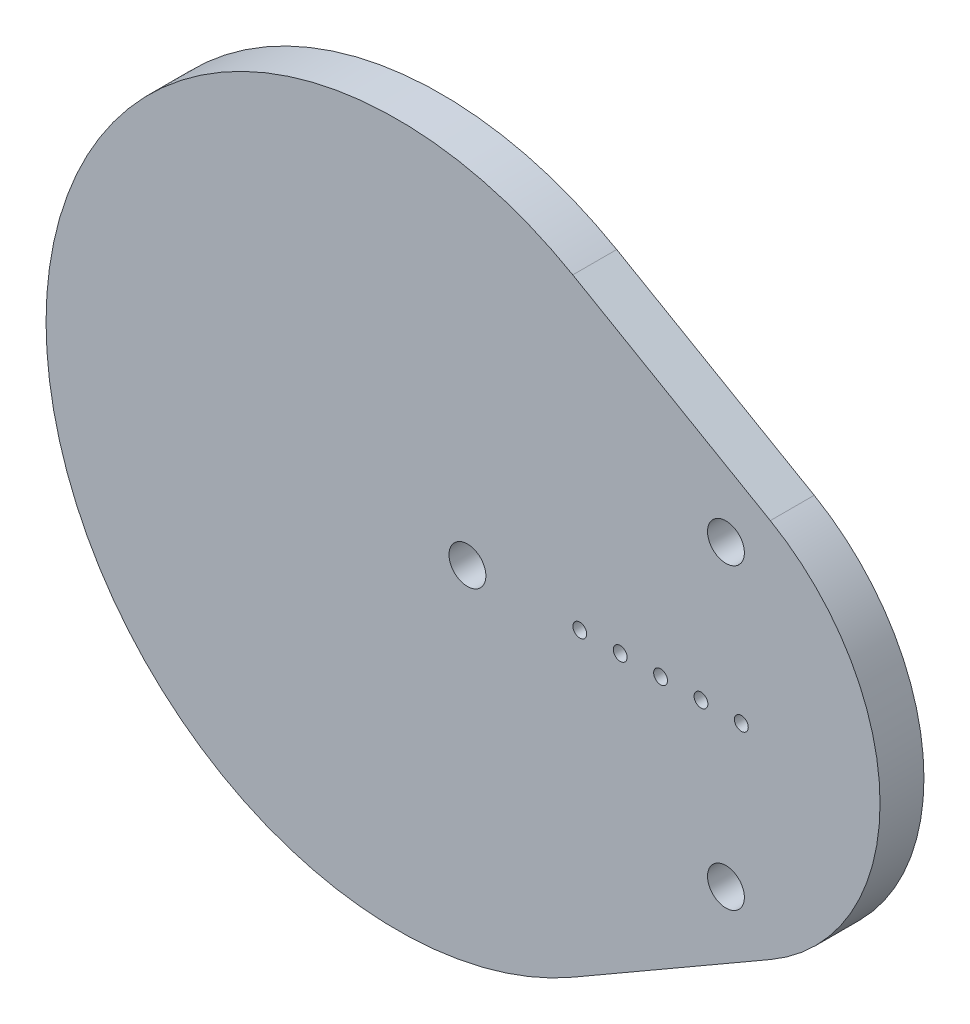
ISO-10303-21;
HEADER;
FILE_DESCRIPTION(('STEP AP214'),'2;1');
FILE_NAME('part.step','',(''),(''),'','','');
FILE_SCHEMA(('AUTOMOTIVE_DESIGN { 1 0 10303 214 1 1 1 1 }'));
ENDSEC;
DATA;
#1=APPLICATION_CONTEXT('core data for automotive mechanical design processes');
#2=APPLICATION_PROTOCOL_DEFINITION('international standard','automotive_design',2000,#1);
#3=PRODUCT_CONTEXT('',#1,'mechanical');
#4=PRODUCT('Part','Part','',(#3));
#5=PRODUCT_RELATED_PRODUCT_CATEGORY('part','',(#4));
#6=PRODUCT_DEFINITION_FORMATION('','',#4);
#7=PRODUCT_DEFINITION_CONTEXT('part definition',#1,'design');
#8=PRODUCT_DEFINITION('design','',#6,#7);
#9=PRODUCT_DEFINITION_SHAPE('','',#8);
#10=(LENGTH_UNIT() NAMED_UNIT(*) SI_UNIT(.MILLI.,.METRE.));
#11=(NAMED_UNIT(*) PLANE_ANGLE_UNIT() SI_UNIT($,.RADIAN.));
#12=(NAMED_UNIT(*) SI_UNIT($,.STERADIAN.) SOLID_ANGLE_UNIT());
#13=UNCERTAINTY_MEASURE_WITH_UNIT(LENGTH_MEASURE(1.E-05),#10,'distance_accuracy_value','');
#14=(GEOMETRIC_REPRESENTATION_CONTEXT(3) GLOBAL_UNCERTAINTY_ASSIGNED_CONTEXT((#13)) GLOBAL_UNIT_ASSIGNED_CONTEXT((#10,
#11,#12)) REPRESENTATION_CONTEXT('',''));
#15=CARTESIAN_POINT('',(0.,0.,0.));
#16=DIRECTION('',(0.,0.,1.));
#17=DIRECTION('',(1.,0.,0.));
#18=AXIS2_PLACEMENT_3D('',#15,#16,#17);
#19=CARTESIAN_POINT('',(-38.1,0.,6.35));
#20=DIRECTION('',(0.,0.,-1.));
#21=DIRECTION('',(-1.,0.,0.));
#22=AXIS2_PLACEMENT_3D('',#19,#20,#21);
#23=CYLINDRICAL_SURFACE('',#22,50.8);
#24=CARTESIAN_POINT('',(-38.1,0.,0.));
#25=DIRECTION('',(0.,0.,1.));
#26=DIRECTION('',(1.,0.,0.));
#27=AXIS2_PLACEMENT_3D('',#24,#25,#26);
#28=CIRCLE('',#27,50.8);
#29=CARTESIAN_POINT('',(-12.7,43.9940905122495,0.));
#30=VERTEX_POINT('',#29);
#31=CARTESIAN_POINT('',(-12.7,-43.9940905122495,0.));
#32=VERTEX_POINT('',#31);
#33=EDGE_CURVE('E273',#30,#32,#28,.T.);
#34=ORIENTED_EDGE('',*,*,#33,.T.);
#35=DIRECTION('',(0.,0.,-1.));
#36=VECTOR('',#35,1.);
#37=CARTESIAN_POINT('',(-12.7,-43.9940905122495,6.35));
#38=LINE('',#37,#36);
#39=CARTESIAN_POINT('',(-12.7,-43.9940905122495,6.35));
#40=VERTEX_POINT('',#39);
#41=EDGE_CURVE('E227',#40,#32,#38,.T.);
#42=ORIENTED_EDGE('',*,*,#41,.F.);
#43=CARTESIAN_POINT('',(-38.1,0.,6.35));
#44=DIRECTION('',(0.,0.,1.));
#45=DIRECTION('',(1.,0.,0.));
#46=AXIS2_PLACEMENT_3D('',#43,#44,#45);
#47=CIRCLE('',#46,50.8);
#48=CARTESIAN_POINT('',(-12.7,43.9940905122495,6.35));
#49=VERTEX_POINT('',#48);
#50=EDGE_CURVE('E261',#49,#40,#47,.T.);
#51=ORIENTED_EDGE('',*,*,#50,.F.);
#52=DIRECTION('',(0.,0.,-1.));
#53=VECTOR('',#52,1.);
#54=CARTESIAN_POINT('',(-12.7,43.9940905122495,6.35));
#55=LINE('',#54,#53);
#56=EDGE_CURVE('E12',#49,#30,#55,.T.);
#57=ORIENTED_EDGE('',*,*,#56,.T.);
#58=EDGE_LOOP('',(#34,#42,#51,#57));
#59=FACE_BOUND('',#58,.T.);
#60=ADVANCED_FACE('F217',(#59),#23,.T.);
#61=CARTESIAN_POINT('',(15.875,-27.4963065701559,6.35));
#62=DIRECTION('',(0.5,-0.866025403784439,0.));
#63=DIRECTION('',(0.866025403784439,0.5,0.));
#64=AXIS2_PLACEMENT_3D('',#61,#62,#63);
#65=PLANE('',#64);
#66=DIRECTION('',(-0.866025403784439,-0.5,0.));
#67=VECTOR('',#66,1.);
#68=CARTESIAN_POINT('',(15.875,-27.4963065701559,0.));
#69=LINE('',#68,#67);
#70=CARTESIAN_POINT('',(15.875,-27.4963065701559,0.));
#71=VERTEX_POINT('',#70);
#72=EDGE_CURVE('E287',#71,#32,#69,.T.);
#73=ORIENTED_EDGE('',*,*,#72,.F.);
#74=DIRECTION('',(0.,0.,-1.));
#75=VECTOR('',#74,1.);
#76=CARTESIAN_POINT('',(15.875,-27.4963065701559,6.35));
#77=LINE('',#76,#75);
#78=CARTESIAN_POINT('',(15.875,-27.4963065701559,6.35));
#79=VERTEX_POINT('',#78);
#80=EDGE_CURVE('E250',#79,#71,#77,.T.);
#81=ORIENTED_EDGE('',*,*,#80,.F.);
#82=DIRECTION('',(-0.866025403784439,-0.5,0.));
#83=VECTOR('',#82,1.);
#84=CARTESIAN_POINT('',(15.875,-27.4963065701559,6.35));
#85=LINE('',#84,#83);
#86=EDGE_CURVE('E268',#79,#40,#85,.T.);
#87=ORIENTED_EDGE('',*,*,#86,.T.);
#88=ORIENTED_EDGE('',*,*,#41,.T.);
#89=EDGE_LOOP('',(#73,#81,#87,#88));
#90=FACE_BOUND('',#89,.T.);
#91=ADVANCED_FACE('F278',(#90),#65,.T.);
#92=CARTESIAN_POINT('',(15.875,27.4963065701559,6.35));
#93=DIRECTION('',(-0.5,-0.866025403784439,0.));
#94=DIRECTION('',(0.866025403784439,-0.5,0.));
#95=AXIS2_PLACEMENT_3D('',#92,#93,#94);
#96=PLANE('',#95);
#97=DIRECTION('',(-0.866025403784439,0.5,0.));
#98=VECTOR('',#97,1.);
#99=CARTESIAN_POINT('',(15.875,27.4963065701559,0.));
#100=LINE('',#99,#98);
#101=CARTESIAN_POINT('',(15.875,27.4963065701559,0.));
#102=VERTEX_POINT('',#101);
#103=EDGE_CURVE('E283',#102,#30,#100,.T.);
#104=ORIENTED_EDGE('',*,*,#103,.T.);
#105=ORIENTED_EDGE('',*,*,#56,.F.);
#106=DIRECTION('',(-0.866025403784439,0.5,0.));
#107=VECTOR('',#106,1.);
#108=CARTESIAN_POINT('',(15.875,27.4963065701559,6.35));
#109=LINE('',#108,#107);
#110=CARTESIAN_POINT('',(15.875,27.4963065701559,6.35));
#111=VERTEX_POINT('',#110);
#112=EDGE_CURVE('E269',#111,#49,#109,.T.);
#113=ORIENTED_EDGE('',*,*,#112,.F.);
#114=DIRECTION('',(0.,0.,-1.));
#115=VECTOR('',#114,1.);
#116=CARTESIAN_POINT('',(15.875,27.4963065701559,6.35));
#117=LINE('',#116,#115);
#118=EDGE_CURVE('E236',#111,#102,#117,.T.);
#119=ORIENTED_EDGE('',*,*,#118,.T.);
#120=EDGE_LOOP('',(#104,#105,#113,#119));
#121=FACE_BOUND('',#120,.T.);
#122=ADVANCED_FACE('F341',(#121),#96,.F.);
#123=CARTESIAN_POINT('',(0.,0.,0.));
#124=DIRECTION('',(0.,0.,1.));
#125=DIRECTION('',(1.,0.,0.));
#126=AXIS2_PLACEMENT_3D('',#123,#124,#125);
#127=PLANE('',#126);
#128=ORIENTED_EDGE('',*,*,#103,.F.);
#129=CARTESIAN_POINT('',(0.,0.,0.));
#130=DIRECTION('',(0.,0.,1.));
#131=DIRECTION('',(1.,0.,0.));
#132=AXIS2_PLACEMENT_3D('',#129,#130,#131);
#133=CIRCLE('',#132,31.75);
#134=EDGE_CURVE('E221',#71,#102,#133,.T.);
#135=ORIENTED_EDGE('',*,*,#134,.F.);
#136=ORIENTED_EDGE('',*,*,#72,.T.);
#137=ORIENTED_EDGE('',*,*,#33,.F.);
#138=EDGE_LOOP('',(#128,#135,#136,#137));
#139=FACE_BOUND('',#138,.T.);
#140=CARTESIAN_POINT('',(9.45497693541205,21.59,0.));
#141=DIRECTION('',(0.,0.,1.));
#142=DIRECTION('',(1.,0.,0.));
#143=AXIS2_PLACEMENT_3D('',#140,#141,#142);
#144=CIRCLE('',#143,2.66500000000001);
#145=CARTESIAN_POINT('',(12.1199769354121,21.59,0.));
#146=VERTEX_POINT('',#145);
#147=EDGE_CURVE('E330',#146,#146,#144,.T.);
#148=ORIENTED_EDGE('',*,*,#147,.T.);
#149=EDGE_LOOP('',(#148));
#150=FACE_BOUND('',#149,.T.);
#151=CARTESIAN_POINT('',(9.45497693541207,-21.59,0.));
#152=DIRECTION('',(0.,0.,1.));
#153=DIRECTION('',(1.,0.,0.));
#154=AXIS2_PLACEMENT_3D('',#151,#152,#153);
#155=CIRCLE('',#154,2.66500000000001);
#156=CARTESIAN_POINT('',(12.1199769354121,-21.59,0.));
#157=VERTEX_POINT('',#156);
#158=EDGE_CURVE('E324',#157,#157,#155,.T.);
#159=ORIENTED_EDGE('',*,*,#158,.T.);
#160=EDGE_LOOP('',(#159));
#161=FACE_BOUND('',#160,.T.);
#162=CARTESIAN_POINT('',(-27.94,0.,0.));
#163=DIRECTION('',(0.,0.,1.));
#164=DIRECTION('',(1.,0.,0.));
#165=AXIS2_PLACEMENT_3D('',#162,#163,#164);
#166=CIRCLE('',#165,2.665);
#167=CARTESIAN_POINT('',(-25.275,0.,0.));
#168=VERTEX_POINT('',#167);
#169=EDGE_CURVE('E318',#168,#168,#166,.T.);
#170=ORIENTED_EDGE('',*,*,#169,.T.);
#171=EDGE_LOOP('',(#170));
#172=FACE_BOUND('',#171,.T.);
#173=CARTESIAN_POINT('',(-11.684,0.,0.));
#174=DIRECTION('',(0.,0.,1.));
#175=DIRECTION('',(1.,0.,0.));
#176=AXIS2_PLACEMENT_3D('',#173,#174,#175);
#177=CIRCLE('',#176,1.);
#178=CARTESIAN_POINT('',(-10.684,0.,0.));
#179=VERTEX_POINT('',#178);
#180=EDGE_CURVE('E312',#179,#179,#177,.T.);
#181=ORIENTED_EDGE('',*,*,#180,.T.);
#182=EDGE_LOOP('',(#181));
#183=FACE_BOUND('',#182,.T.);
#184=CARTESIAN_POINT('',(0.,0.,0.));
#185=DIRECTION('',(0.,0.,1.));
#186=DIRECTION('',(1.,0.,0.));
#187=AXIS2_PLACEMENT_3D('',#184,#185,#186);
#188=CIRCLE('',#187,1.);
#189=CARTESIAN_POINT('',(1.,0.,0.));
#190=VERTEX_POINT('',#189);
#191=EDGE_CURVE('E306',#190,#190,#188,.T.);
#192=ORIENTED_EDGE('',*,*,#191,.T.);
#193=EDGE_LOOP('',(#192));
#194=FACE_BOUND('',#193,.T.);
#195=CARTESIAN_POINT('',(5.842,0.,0.));
#196=DIRECTION('',(0.,0.,1.));
#197=DIRECTION('',(1.,0.,0.));
#198=AXIS2_PLACEMENT_3D('',#195,#196,#197);
#199=CIRCLE('',#198,1.);
#200=CARTESIAN_POINT('',(6.842,0.,0.));
#201=VERTEX_POINT('',#200);
#202=EDGE_CURVE('E300',#201,#201,#199,.T.);
#203=ORIENTED_EDGE('',*,*,#202,.T.);
#204=EDGE_LOOP('',(#203));
#205=FACE_BOUND('',#204,.T.);
#206=CARTESIAN_POINT('',(11.684,0.,0.));
#207=DIRECTION('',(0.,0.,1.));
#208=DIRECTION('',(1.,0.,0.));
#209=AXIS2_PLACEMENT_3D('',#206,#207,#208);
#210=CIRCLE('',#209,1.);
#211=CARTESIAN_POINT('',(12.684,0.,0.));
#212=VERTEX_POINT('',#211);
#213=EDGE_CURVE('E293',#212,#212,#210,.T.);
#214=ORIENTED_EDGE('',*,*,#213,.T.);
#215=EDGE_LOOP('',(#214));
#216=FACE_BOUND('',#215,.T.);
#217=CARTESIAN_POINT('',(-5.842,0.,0.));
#218=DIRECTION('',(0.,0.,1.));
#219=DIRECTION('',(1.,0.,0.));
#220=AXIS2_PLACEMENT_3D('',#217,#218,#219);
#221=CIRCLE('',#220,1.);
#222=CARTESIAN_POINT('',(-4.842,0.,0.));
#223=VERTEX_POINT('',#222);
#224=EDGE_CURVE('E294',#223,#223,#221,.T.);
#225=ORIENTED_EDGE('',*,*,#224,.T.);
#226=EDGE_LOOP('',(#225));
#227=FACE_BOUND('',#226,.T.);
#228=ADVANCED_FACE('F339',(#139,#150,#161,#172,#183,#194,#205,#216,#227),#127,.F.);
#229=CARTESIAN_POINT('',(0.,0.,6.35));
#230=DIRECTION('',(0.,0.,1.));
#231=DIRECTION('',(1.,0.,0.));
#232=AXIS2_PLACEMENT_3D('',#229,#230,#231);
#233=PLANE('',#232);
#234=ORIENTED_EDGE('',*,*,#112,.T.);
#235=ORIENTED_EDGE('',*,*,#50,.T.);
#236=ORIENTED_EDGE('',*,*,#86,.F.);
#237=CARTESIAN_POINT('',(0.,0.,6.35));
#238=DIRECTION('',(0.,0.,1.));
#239=DIRECTION('',(1.,0.,0.));
#240=AXIS2_PLACEMENT_3D('',#237,#238,#239);
#241=CIRCLE('',#240,31.75);
#242=EDGE_CURVE('E285',#79,#111,#241,.T.);
#243=ORIENTED_EDGE('',*,*,#242,.T.);
#244=EDGE_LOOP('',(#234,#235,#236,#243));
#245=FACE_BOUND('',#244,.T.);
#246=CARTESIAN_POINT('',(11.684,0.,6.35));
#247=DIRECTION('',(0.,0.,1.));
#248=DIRECTION('',(1.,0.,0.));
#249=AXIS2_PLACEMENT_3D('',#246,#247,#248);
#250=CIRCLE('',#249,1.);
#251=CARTESIAN_POINT('',(12.684,0.,6.35));
#252=VERTEX_POINT('',#251);
#253=EDGE_CURVE('E297',#252,#252,#250,.T.);
#254=ORIENTED_EDGE('',*,*,#253,.F.);
#255=EDGE_LOOP('',(#254));
#256=FACE_BOUND('',#255,.T.);
#257=CARTESIAN_POINT('',(0.,0.,6.35));
#258=DIRECTION('',(0.,0.,1.));
#259=DIRECTION('',(1.,0.,0.));
#260=AXIS2_PLACEMENT_3D('',#257,#258,#259);
#261=CIRCLE('',#260,1.);
#262=CARTESIAN_POINT('',(1.,0.,6.35));
#263=VERTEX_POINT('',#262);
#264=EDGE_CURVE('E309',#263,#263,#261,.T.);
#265=ORIENTED_EDGE('',*,*,#264,.F.);
#266=EDGE_LOOP('',(#265));
#267=FACE_BOUND('',#266,.T.);
#268=CARTESIAN_POINT('',(-27.94,0.,6.35));
#269=DIRECTION('',(0.,0.,1.));
#270=DIRECTION('',(1.,0.,0.));
#271=AXIS2_PLACEMENT_3D('',#268,#269,#270);
#272=CIRCLE('',#271,2.665);
#273=CARTESIAN_POINT('',(-25.275,0.,6.35));
#274=VERTEX_POINT('',#273);
#275=EDGE_CURVE('E321',#274,#274,#272,.T.);
#276=ORIENTED_EDGE('',*,*,#275,.F.);
#277=EDGE_LOOP('',(#276));
#278=FACE_BOUND('',#277,.T.);
#279=CARTESIAN_POINT('',(9.45497693541205,21.59,6.35));
#280=DIRECTION('',(0.,0.,1.));
#281=DIRECTION('',(1.,0.,0.));
#282=AXIS2_PLACEMENT_3D('',#279,#280,#281);
#283=CIRCLE('',#282,2.66500000000001);
#284=CARTESIAN_POINT('',(12.1199769354121,21.59,6.35));
#285=VERTEX_POINT('',#284);
#286=EDGE_CURVE('E333',#285,#285,#283,.T.);
#287=ORIENTED_EDGE('',*,*,#286,.F.);
#288=EDGE_LOOP('',(#287));
#289=FACE_BOUND('',#288,.T.);
#290=CARTESIAN_POINT('',(9.45497693541207,-21.59,6.35));
#291=DIRECTION('',(0.,0.,1.));
#292=DIRECTION('',(1.,0.,0.));
#293=AXIS2_PLACEMENT_3D('',#290,#291,#292);
#294=CIRCLE('',#293,2.66500000000001);
#295=CARTESIAN_POINT('',(12.1199769354121,-21.59,6.35));
#296=VERTEX_POINT('',#295);
#297=EDGE_CURVE('E327',#296,#296,#294,.T.);
#298=ORIENTED_EDGE('',*,*,#297,.F.);
#299=EDGE_LOOP('',(#298));
#300=FACE_BOUND('',#299,.T.);
#301=CARTESIAN_POINT('',(-11.684,0.,6.35));
#302=DIRECTION('',(0.,0.,1.));
#303=DIRECTION('',(1.,0.,0.));
#304=AXIS2_PLACEMENT_3D('',#301,#302,#303);
#305=CIRCLE('',#304,1.);
#306=CARTESIAN_POINT('',(-10.684,0.,6.35));
#307=VERTEX_POINT('',#306);
#308=EDGE_CURVE('E315',#307,#307,#305,.T.);
#309=ORIENTED_EDGE('',*,*,#308,.F.);
#310=EDGE_LOOP('',(#309));
#311=FACE_BOUND('',#310,.T.);
#312=CARTESIAN_POINT('',(5.842,0.,6.35));
#313=DIRECTION('',(0.,0.,1.));
#314=DIRECTION('',(1.,0.,0.));
#315=AXIS2_PLACEMENT_3D('',#312,#313,#314);
#316=CIRCLE('',#315,1.);
#317=CARTESIAN_POINT('',(6.842,0.,6.35));
#318=VERTEX_POINT('',#317);
#319=EDGE_CURVE('E303',#318,#318,#316,.T.);
#320=ORIENTED_EDGE('',*,*,#319,.F.);
#321=EDGE_LOOP('',(#320));
#322=FACE_BOUND('',#321,.T.);
#323=CARTESIAN_POINT('',(-5.842,0.,6.35));
#324=DIRECTION('',(0.,0.,1.));
#325=DIRECTION('',(1.,0.,0.));
#326=AXIS2_PLACEMENT_3D('',#323,#324,#325);
#327=CIRCLE('',#326,1.);
#328=CARTESIAN_POINT('',(-4.842,0.,6.35));
#329=VERTEX_POINT('',#328);
#330=EDGE_CURVE('E290',#329,#329,#327,.T.);
#331=ORIENTED_EDGE('',*,*,#330,.F.);
#332=EDGE_LOOP('',(#331));
#333=FACE_BOUND('',#332,.T.);
#334=ADVANCED_FACE('F265',(#245,#256,#267,#278,#289,#300,#311,#322,#333),#233,.T.);
#335=CARTESIAN_POINT('',(-5.842,0.,6.35));
#336=DIRECTION('',(0.,0.,-1.));
#337=DIRECTION('',(-1.,0.,0.));
#338=AXIS2_PLACEMENT_3D('',#335,#336,#337);
#339=CYLINDRICAL_SURFACE('',#338,1.);
#340=ORIENTED_EDGE('',*,*,#330,.T.);
#341=EDGE_LOOP('',(#340));
#342=FACE_BOUND('',#341,.T.);
#343=ORIENTED_EDGE('',*,*,#224,.F.);
#344=EDGE_LOOP('',(#343));
#345=FACE_BOUND('',#344,.T.);
#346=ADVANCED_FACE('F357',(#342,#345),#339,.F.);
#347=CARTESIAN_POINT('',(11.684,0.,6.35));
#348=DIRECTION('',(0.,0.,-1.));
#349=DIRECTION('',(-1.,0.,0.));
#350=AXIS2_PLACEMENT_3D('',#347,#348,#349);
#351=CYLINDRICAL_SURFACE('',#350,1.);
#352=ORIENTED_EDGE('',*,*,#253,.T.);
#353=EDGE_LOOP('',(#352));
#354=FACE_BOUND('',#353,.T.);
#355=ORIENTED_EDGE('',*,*,#213,.F.);
#356=EDGE_LOOP('',(#355));
#357=FACE_BOUND('',#356,.T.);
#358=ADVANCED_FACE('F361',(#354,#357),#351,.F.);
#359=CARTESIAN_POINT('',(5.842,0.,6.35));
#360=DIRECTION('',(0.,0.,-1.));
#361=DIRECTION('',(-1.,0.,0.));
#362=AXIS2_PLACEMENT_3D('',#359,#360,#361);
#363=CYLINDRICAL_SURFACE('',#362,1.);
#364=ORIENTED_EDGE('',*,*,#319,.T.);
#365=EDGE_LOOP('',(#364));
#366=FACE_BOUND('',#365,.T.);
#367=ORIENTED_EDGE('',*,*,#202,.F.);
#368=EDGE_LOOP('',(#367));
#369=FACE_BOUND('',#368,.T.);
#370=ADVANCED_FACE('F388',(#366,#369),#363,.F.);
#371=CARTESIAN_POINT('',(0.,0.,6.35));
#372=DIRECTION('',(0.,0.,-1.));
#373=DIRECTION('',(-1.,0.,0.));
#374=AXIS2_PLACEMENT_3D('',#371,#372,#373);
#375=CYLINDRICAL_SURFACE('',#374,1.);
#376=ORIENTED_EDGE('',*,*,#264,.T.);
#377=EDGE_LOOP('',(#376));
#378=FACE_BOUND('',#377,.T.);
#379=ORIENTED_EDGE('',*,*,#191,.F.);
#380=EDGE_LOOP('',(#379));
#381=FACE_BOUND('',#380,.T.);
#382=ADVANCED_FACE('F384',(#378,#381),#375,.F.);
#383=CARTESIAN_POINT('',(-11.684,0.,6.35));
#384=DIRECTION('',(0.,0.,-1.));
#385=DIRECTION('',(-1.,0.,0.));
#386=AXIS2_PLACEMENT_3D('',#383,#384,#385);
#387=CYLINDRICAL_SURFACE('',#386,1.);
#388=ORIENTED_EDGE('',*,*,#308,.T.);
#389=EDGE_LOOP('',(#388));
#390=FACE_BOUND('',#389,.T.);
#391=ORIENTED_EDGE('',*,*,#180,.F.);
#392=EDGE_LOOP('',(#391));
#393=FACE_BOUND('',#392,.T.);
#394=ADVANCED_FACE('F380',(#390,#393),#387,.F.);
#395=CARTESIAN_POINT('',(-27.94,0.,6.35));
#396=DIRECTION('',(0.,0.,-1.));
#397=DIRECTION('',(-1.,0.,0.));
#398=AXIS2_PLACEMENT_3D('',#395,#396,#397);
#399=CYLINDRICAL_SURFACE('',#398,2.665);
#400=ORIENTED_EDGE('',*,*,#275,.T.);
#401=EDGE_LOOP('',(#400));
#402=FACE_BOUND('',#401,.T.);
#403=ORIENTED_EDGE('',*,*,#169,.F.);
#404=EDGE_LOOP('',(#403));
#405=FACE_BOUND('',#404,.T.);
#406=ADVANCED_FACE('F373',(#402,#405),#399,.F.);
#407=CARTESIAN_POINT('',(9.45497693541207,-21.59,6.35));
#408=DIRECTION('',(0.,0.,-1.));
#409=DIRECTION('',(-1.,0.,0.));
#410=AXIS2_PLACEMENT_3D('',#407,#408,#409);
#411=CYLINDRICAL_SURFACE('',#410,2.66500000000001);
#412=ORIENTED_EDGE('',*,*,#297,.T.);
#413=EDGE_LOOP('',(#412));
#414=FACE_BOUND('',#413,.T.);
#415=ORIENTED_EDGE('',*,*,#158,.F.);
#416=EDGE_LOOP('',(#415));
#417=FACE_BOUND('',#416,.T.);
#418=ADVANCED_FACE('F368',(#414,#417),#411,.F.);
#419=CARTESIAN_POINT('',(9.45497693541205,21.59,6.35));
#420=DIRECTION('',(0.,0.,-1.));
#421=DIRECTION('',(-1.,0.,0.));
#422=AXIS2_PLACEMENT_3D('',#419,#420,#421);
#423=CYLINDRICAL_SURFACE('',#422,2.66500000000001);
#424=ORIENTED_EDGE('',*,*,#286,.T.);
#425=EDGE_LOOP('',(#424));
#426=FACE_BOUND('',#425,.T.);
#427=ORIENTED_EDGE('',*,*,#147,.F.);
#428=EDGE_LOOP('',(#427));
#429=FACE_BOUND('',#428,.T.);
#430=ADVANCED_FACE('F364',(#426,#429),#423,.F.);
#431=CARTESIAN_POINT('',(0.,0.,6.35));
#432=DIRECTION('',(0.,0.,-1.));
#433=DIRECTION('',(-1.,0.,0.));
#434=AXIS2_PLACEMENT_3D('',#431,#432,#433);
#435=CYLINDRICAL_SURFACE('',#434,31.75);
#436=ORIENTED_EDGE('',*,*,#134,.T.);
#437=ORIENTED_EDGE('',*,*,#118,.F.);
#438=ORIENTED_EDGE('',*,*,#242,.F.);
#439=ORIENTED_EDGE('',*,*,#80,.T.);
#440=EDGE_LOOP('',(#436,#437,#438,#439));
#441=FACE_BOUND('',#440,.T.);
#442=ADVANCED_FACE('F219',(#441),#435,.T.);
#443=CLOSED_SHELL('',(#60,#91,#122,#228,#334,#346,#358,#370,#382,#394,#406,#418,#430,#442));
#444=MANIFOLD_SOLID_BREP('B2',#443);
#445=ADVANCED_BREP_SHAPE_REPRESENTATION('',(#18,#444),#14);
#446=SHAPE_DEFINITION_REPRESENTATION(#9,#445);
ENDSEC;
END-ISO-10303-21;
